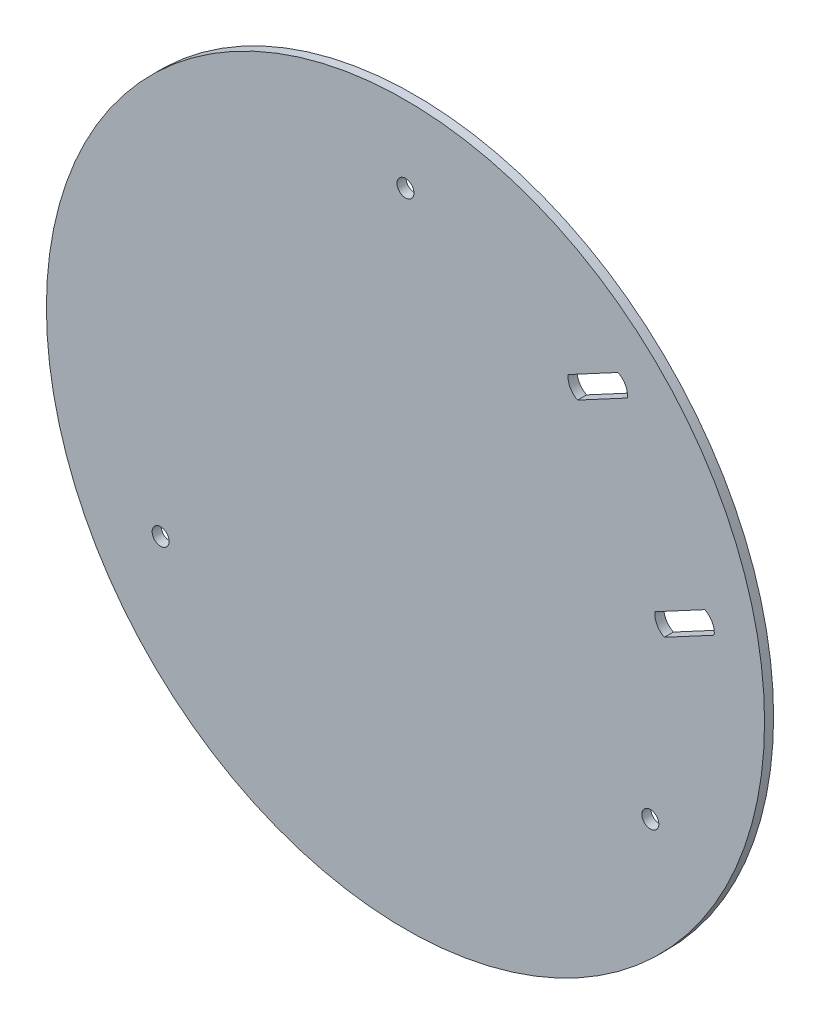
ISO-10303-21;
HEADER;
FILE_DESCRIPTION(('STEP AP214'),'2;1');
FILE_NAME('part.step','',(''),(''),'','','');
FILE_SCHEMA(('AUTOMOTIVE_DESIGN { 1 0 10303 214 1 1 1 1 }'));
ENDSEC;
DATA;
#1=APPLICATION_CONTEXT('core data for automotive mechanical design processes');
#2=APPLICATION_PROTOCOL_DEFINITION('international standard','automotive_design',2000,#1);
#3=PRODUCT_CONTEXT('',#1,'mechanical');
#4=PRODUCT('Part','Part','',(#3));
#5=PRODUCT_RELATED_PRODUCT_CATEGORY('part','',(#4));
#6=PRODUCT_DEFINITION_FORMATION('','',#4);
#7=PRODUCT_DEFINITION_CONTEXT('part definition',#1,'design');
#8=PRODUCT_DEFINITION('design','',#6,#7);
#9=PRODUCT_DEFINITION_SHAPE('','',#8);
#10=(LENGTH_UNIT() NAMED_UNIT(*) SI_UNIT(.MILLI.,.METRE.));
#11=(NAMED_UNIT(*) PLANE_ANGLE_UNIT() SI_UNIT($,.RADIAN.));
#12=(NAMED_UNIT(*) SI_UNIT($,.STERADIAN.) SOLID_ANGLE_UNIT());
#13=UNCERTAINTY_MEASURE_WITH_UNIT(LENGTH_MEASURE(1.E-05),#10,'distance_accuracy_value','');
#14=(GEOMETRIC_REPRESENTATION_CONTEXT(3) GLOBAL_UNCERTAINTY_ASSIGNED_CONTEXT((#13)) GLOBAL_UNIT_ASSIGNED_CONTEXT((#10,
#11,#12)) REPRESENTATION_CONTEXT('',''));
#15=CARTESIAN_POINT('',(0.,0.,0.));
#16=DIRECTION('',(0.,0.,1.));
#17=DIRECTION('',(1.,0.,0.));
#18=AXIS2_PLACEMENT_3D('',#15,#16,#17);
#19=CARTESIAN_POINT('',(0.,0.,1.6));
#20=DIRECTION('',(0.,0.,1.));
#21=DIRECTION('',(1.,0.,0.));
#22=AXIS2_PLACEMENT_3D('',#19,#20,#21);
#23=PLANE('',#22);
#24=CARTESIAN_POINT('',(0.,50.,1.6));
#25=DIRECTION('',(0.,0.,-1.));
#26=DIRECTION('',(-1.,0.,0.));
#27=AXIS2_PLACEMENT_3D('',#24,#25,#26);
#28=CIRCLE('',#27,1.5);
#29=CARTESIAN_POINT('',(-1.5,50.,1.6));
#30=VERTEX_POINT('',#29);
#31=EDGE_CURVE('E167',#30,#30,#28,.T.);
#32=ORIENTED_EDGE('',*,*,#31,.T.);
#33=EDGE_LOOP('',(#32));
#34=FACE_BOUND('',#33,.T.);
#35=CARTESIAN_POINT('',(43.3012701892187,-25.0000000000019,1.6));
#36=DIRECTION('',(0.,0.,-1.));
#37=DIRECTION('',(-1.,0.,0.));
#38=AXIS2_PLACEMENT_3D('',#35,#36,#37);
#39=CIRCLE('',#38,1.50000000000405);
#40=CARTESIAN_POINT('',(41.8012701892147,-25.0000000000019,1.6));
#41=VERTEX_POINT('',#40);
#42=EDGE_CURVE('E176',#41,#41,#39,.T.);
#43=ORIENTED_EDGE('',*,*,#42,.T.);
#44=EDGE_LOOP('',(#43));
#45=FACE_BOUND('',#44,.T.);
#46=CARTESIAN_POINT('',(-43.3012701892251,-24.9999999999982,1.6));
#47=DIRECTION('',(0.,0.,-1.));
#48=DIRECTION('',(-1.,0.,0.));
#49=AXIS2_PLACEMENT_3D('',#46,#47,#48);
#50=CIRCLE('',#49,1.50000000000274);
#51=CARTESIAN_POINT('',(-44.8012701892279,-24.9999999999982,1.6));
#52=VERTEX_POINT('',#51);
#53=EDGE_CURVE('E166',#52,#52,#50,.T.);
#54=ORIENTED_EDGE('',*,*,#53,.T.);
#55=EDGE_LOOP('',(#54));
#56=FACE_BOUND('',#55,.T.);
#57=CARTESIAN_POINT('',(0.,0.,1.6));
#58=DIRECTION('',(0.,0.,1.));
#59=DIRECTION('',(1.,0.,0.));
#60=AXIS2_PLACEMENT_3D('',#57,#58,#59);
#61=CIRCLE('',#60,63.5);
#62=CARTESIAN_POINT('',(63.5,0.,1.6));
#63=VERTEX_POINT('',#62);
#64=EDGE_CURVE('E11',#63,#63,#61,.T.);
#65=ORIENTED_EDGE('',*,*,#64,.T.);
#66=EDGE_LOOP('',(#65));
#67=FACE_BOUND('',#66,.T.);
#68=DIRECTION('',(0.881460712640204,0.472257357880026,0.));
#69=VECTOR('',#68,1.);
#70=CARTESIAN_POINT('',(-8.50063244184047,15.8662928275237,1.6));
#71=LINE('',#70,#69);
#72=CARTESIAN_POINT('',(28.7725515184467,35.8360261627023,1.6));
#73=VERTEX_POINT('',#72);
#74=CARTESIAN_POINT('',(37.5871586448488,40.5585997415026,1.6));
#75=VERTEX_POINT('',#74);
#76=EDGE_CURVE('E152',#73,#75,#71,.T.);
#77=ORIENTED_EDGE('',*,*,#76,.T.);
#78=CARTESIAN_POINT('',(36.2099572395383,37.8354000996822,1.6));
#79=DIRECTION('',(0.,0.,1.));
#80=DIRECTION('',(1.,0.,0.));
#81=AXIS2_PLACEMENT_3D('',#78,#79,#80);
#82=CIRCLE('',#81,3.05163890393342);
#83=CARTESIAN_POINT('',(39.2400593974289,37.4734872472619,1.6));
#84=VERTEX_POINT('',#83);
#85=EDGE_CURVE('E160',#75,#84,#82,.F.);
#86=ORIENTED_EDGE('',*,*,#85,.T.);
#87=DIRECTION('',(0.881460712640204,0.472257357880026,0.));
#88=VECTOR('',#87,1.);
#89=CARTESIAN_POINT('',(-6.84773168926038,12.781180333283,1.6));
#90=LINE('',#89,#88);
#91=CARTESIAN_POINT('',(30.4254522710268,32.7509136684616,1.6));
#92=VERTEX_POINT('',#91);
#93=EDGE_CURVE('E120',#92,#84,#90,.T.);
#94=ORIENTED_EDGE('',*,*,#93,.F.);
#95=CARTESIAN_POINT('',(31.8026536763373,35.474113310282,1.6));
#96=DIRECTION('',(0.,0.,1.));
#97=DIRECTION('',(1.,0.,0.));
#98=AXIS2_PLACEMENT_3D('',#95,#96,#97);
#99=CIRCLE('',#98,3.05163890393342);
#100=EDGE_CURVE('E158',#73,#92,#99,.T.);
#101=ORIENTED_EDGE('',*,*,#100,.F.);
#102=EDGE_LOOP('',(#77,#86,#94,#101));
#103=FACE_BOUND('',#102,.T.);
#104=DIRECTION('',(0.881460712640204,0.472257357880026,0.));
#105=VECTOR('',#104,1.);
#106=CARTESIAN_POINT('',(6.84773168926038,-12.781180333283,1.6));
#107=LINE('',#106,#105);
#108=CARTESIAN_POINT('',(44.1209156495476,7.18855300189569,1.6));
#109=VERTEX_POINT('',#108);
#110=CARTESIAN_POINT('',(52.9355227759496,11.911126580696,1.6));
#111=VERTEX_POINT('',#110);
#112=EDGE_CURVE('E156',#109,#111,#107,.T.);
#113=ORIENTED_EDGE('',*,*,#112,.T.);
#114=CARTESIAN_POINT('',(51.5583213706392,9.18792693887552,1.6));
#115=DIRECTION('',(0.,0.,1.));
#116=DIRECTION('',(1.,0.,0.));
#117=AXIS2_PLACEMENT_3D('',#114,#115,#116);
#118=CIRCLE('',#117,3.05163890393343);
#119=CARTESIAN_POINT('',(54.5884235285297,8.82601408645523,1.6));
#120=VERTEX_POINT('',#119);
#121=EDGE_CURVE('E119',#111,#120,#118,.F.);
#122=ORIENTED_EDGE('',*,*,#121,.T.);
#123=DIRECTION('',(0.881460712640204,0.472257357880027,0.));
#124=VECTOR('',#123,1.);
#125=CARTESIAN_POINT('',(8.50063244184048,-15.8662928275237,1.6));
#126=LINE('',#125,#124);
#127=CARTESIAN_POINT('',(45.7738164021277,4.10344050765497,1.6));
#128=VERTEX_POINT('',#127);
#129=EDGE_CURVE('E154',#128,#120,#126,.T.);
#130=ORIENTED_EDGE('',*,*,#129,.F.);
#131=CARTESIAN_POINT('',(47.1510178074381,6.82664014947539,1.6));
#132=DIRECTION('',(0.,0.,1.));
#133=DIRECTION('',(1.,0.,0.));
#134=AXIS2_PLACEMENT_3D('',#131,#132,#133);
#135=CIRCLE('',#134,3.05163890393343);
#136=EDGE_CURVE('E163',#109,#128,#135,.T.);
#137=ORIENTED_EDGE('',*,*,#136,.F.);
#138=EDGE_LOOP('',(#113,#122,#130,#137));
#139=FACE_BOUND('',#138,.T.);
#140=ADVANCED_FACE('F34',(#34,#45,#56,#67,#103,#139),#23,.T.);
#141=CARTESIAN_POINT('',(0.,0.,0.));
#142=DIRECTION('',(0.,0.,1.));
#143=DIRECTION('',(1.,0.,0.));
#144=AXIS2_PLACEMENT_3D('',#141,#142,#143);
#145=PLANE('',#144);
#146=CARTESIAN_POINT('',(0.,50.,0.));
#147=DIRECTION('',(0.,0.,-1.));
#148=DIRECTION('',(-1.,0.,0.));
#149=AXIS2_PLACEMENT_3D('',#146,#147,#148);
#150=CIRCLE('',#149,1.5);
#151=CARTESIAN_POINT('',(-1.5,50.,0.));
#152=VERTEX_POINT('',#151);
#153=EDGE_CURVE('E170',#152,#152,#150,.T.);
#154=ORIENTED_EDGE('',*,*,#153,.F.);
#155=EDGE_LOOP('',(#154));
#156=FACE_BOUND('',#155,.T.);
#157=CARTESIAN_POINT('',(43.3012701892187,-25.0000000000019,0.));
#158=DIRECTION('',(0.,0.,-1.));
#159=DIRECTION('',(-1.,0.,0.));
#160=AXIS2_PLACEMENT_3D('',#157,#158,#159);
#161=CIRCLE('',#160,1.50000000000405);
#162=CARTESIAN_POINT('',(41.8012701892147,-25.0000000000019,0.));
#163=VERTEX_POINT('',#162);
#164=EDGE_CURVE('E173',#163,#163,#161,.T.);
#165=ORIENTED_EDGE('',*,*,#164,.F.);
#166=EDGE_LOOP('',(#165));
#167=FACE_BOUND('',#166,.T.);
#168=CARTESIAN_POINT('',(-43.3012701892251,-24.9999999999982,0.));
#169=DIRECTION('',(0.,0.,-1.));
#170=DIRECTION('',(-1.,0.,0.));
#171=AXIS2_PLACEMENT_3D('',#168,#169,#170);
#172=CIRCLE('',#171,1.50000000000274);
#173=CARTESIAN_POINT('',(-44.8012701892279,-24.9999999999982,0.));
#174=VERTEX_POINT('',#173);
#175=EDGE_CURVE('E179',#174,#174,#172,.T.);
#176=ORIENTED_EDGE('',*,*,#175,.F.);
#177=EDGE_LOOP('',(#176));
#178=FACE_BOUND('',#177,.T.);
#179=CARTESIAN_POINT('',(0.,0.,0.));
#180=DIRECTION('',(0.,0.,1.));
#181=DIRECTION('',(1.,0.,0.));
#182=AXIS2_PLACEMENT_3D('',#179,#180,#181);
#183=CIRCLE('',#182,63.5);
#184=CARTESIAN_POINT('',(63.5,0.,0.));
#185=VERTEX_POINT('',#184);
#186=EDGE_CURVE('E38',#185,#185,#183,.T.);
#187=ORIENTED_EDGE('',*,*,#186,.F.);
#188=EDGE_LOOP('',(#187));
#189=FACE_BOUND('',#188,.T.);
#190=CARTESIAN_POINT('',(36.2099572395383,37.8354000996822,0.));
#191=DIRECTION('',(0.,0.,1.));
#192=DIRECTION('',(1.,0.,0.));
#193=AXIS2_PLACEMENT_3D('',#190,#191,#192);
#194=CIRCLE('',#193,3.05163890393342);
#195=CARTESIAN_POINT('',(39.2400593974289,37.4734872472619,0.));
#196=VERTEX_POINT('',#195);
#197=CARTESIAN_POINT('',(37.5871586448488,40.5585997415026,0.));
#198=VERTEX_POINT('',#197);
#199=EDGE_CURVE('E123',#196,#198,#194,.T.);
#200=ORIENTED_EDGE('',*,*,#199,.T.);
#201=DIRECTION('',(-0.881460712640204,-0.472257357880026,0.));
#202=VECTOR('',#201,1.);
#203=CARTESIAN_POINT('',(37.5871586448488,40.5585997415026,0.));
#204=LINE('',#203,#202);
#205=CARTESIAN_POINT('',(28.7725515184467,35.8360261627023,0.));
#206=VERTEX_POINT('',#205);
#207=EDGE_CURVE('E125',#198,#206,#204,.T.);
#208=ORIENTED_EDGE('',*,*,#207,.T.);
#209=CARTESIAN_POINT('',(31.8026536763373,35.474113310282,0.));
#210=DIRECTION('',(0.,0.,-1.));
#211=DIRECTION('',(-1.,0.,0.));
#212=AXIS2_PLACEMENT_3D('',#209,#210,#211);
#213=CIRCLE('',#212,3.05163890393342);
#214=CARTESIAN_POINT('',(30.4254522710268,32.7509136684616,0.));
#215=VERTEX_POINT('',#214);
#216=EDGE_CURVE('E146',#215,#206,#213,.T.);
#217=ORIENTED_EDGE('',*,*,#216,.F.);
#218=DIRECTION('',(-0.881460712640204,-0.472257357880026,0.));
#219=VECTOR('',#218,1.);
#220=CARTESIAN_POINT('',(39.2400593974289,37.4734872472619,0.));
#221=LINE('',#220,#219);
#222=EDGE_CURVE('E57',#196,#215,#221,.T.);
#223=ORIENTED_EDGE('',*,*,#222,.F.);
#224=EDGE_LOOP('',(#200,#208,#217,#223));
#225=FACE_BOUND('',#224,.T.);
#226=CARTESIAN_POINT('',(51.5583213706392,9.18792693887552,0.));
#227=DIRECTION('',(0.,0.,1.));
#228=DIRECTION('',(1.,0.,0.));
#229=AXIS2_PLACEMENT_3D('',#226,#227,#228);
#230=CIRCLE('',#229,3.05163890393343);
#231=CARTESIAN_POINT('',(54.5884235285297,8.82601408645523,0.));
#232=VERTEX_POINT('',#231);
#233=CARTESIAN_POINT('',(52.9355227759496,11.911126580696,0.));
#234=VERTEX_POINT('',#233);
#235=EDGE_CURVE('E111',#232,#234,#230,.T.);
#236=ORIENTED_EDGE('',*,*,#235,.T.);
#237=DIRECTION('',(-0.881460712640204,-0.472257357880026,0.));
#238=VECTOR('',#237,1.);
#239=CARTESIAN_POINT('',(52.9355227759496,11.911126580696,0.));
#240=LINE('',#239,#238);
#241=CARTESIAN_POINT('',(44.1209156495476,7.18855300189569,0.));
#242=VERTEX_POINT('',#241);
#243=EDGE_CURVE('E103',#234,#242,#240,.T.);
#244=ORIENTED_EDGE('',*,*,#243,.T.);
#245=CARTESIAN_POINT('',(47.1510178074381,6.82664014947539,0.));
#246=DIRECTION('',(0.,0.,-1.));
#247=DIRECTION('',(-1.,0.,0.));
#248=AXIS2_PLACEMENT_3D('',#245,#246,#247);
#249=CIRCLE('',#248,3.05163890393343);
#250=CARTESIAN_POINT('',(45.7738164021277,4.10344050765497,0.));
#251=VERTEX_POINT('',#250);
#252=EDGE_CURVE('E110',#251,#242,#249,.T.);
#253=ORIENTED_EDGE('',*,*,#252,.F.);
#254=DIRECTION('',(-0.881460712640204,-0.472257357880027,0.));
#255=VECTOR('',#254,1.);
#256=CARTESIAN_POINT('',(54.5884235285297,8.82601408645523,0.));
#257=LINE('',#256,#255);
#258=EDGE_CURVE('E49',#232,#251,#257,.T.);
#259=ORIENTED_EDGE('',*,*,#258,.F.);
#260=EDGE_LOOP('',(#236,#244,#253,#259));
#261=FACE_BOUND('',#260,.T.);
#262=ADVANCED_FACE('F122',(#156,#167,#178,#189,#225,#261),#145,.F.);
#263=CARTESIAN_POINT('',(0.,0.,1.6));
#264=DIRECTION('',(0.,0.,-1.));
#265=DIRECTION('',(-1.,0.,0.));
#266=AXIS2_PLACEMENT_3D('',#263,#264,#265);
#267=CYLINDRICAL_SURFACE('',#266,63.5);
#268=ORIENTED_EDGE('',*,*,#64,.F.);
#269=EDGE_LOOP('',(#268));
#270=FACE_BOUND('',#269,.T.);
#271=ORIENTED_EDGE('',*,*,#186,.T.);
#272=EDGE_LOOP('',(#271));
#273=FACE_BOUND('',#272,.T.);
#274=ADVANCED_FACE('F36',(#270,#273),#267,.T.);
#275=CARTESIAN_POINT('',(-43.3012701892251,-24.9999999999982,1.6));
#276=DIRECTION('',(0.,0.,-1.));
#277=DIRECTION('',(-1.,0.,0.));
#278=AXIS2_PLACEMENT_3D('',#275,#276,#277);
#279=CYLINDRICAL_SURFACE('',#278,1.50000000000274);
#280=ORIENTED_EDGE('',*,*,#53,.F.);
#281=EDGE_LOOP('',(#280));
#282=FACE_BOUND('',#281,.T.);
#283=ORIENTED_EDGE('',*,*,#175,.T.);
#284=EDGE_LOOP('',(#283));
#285=FACE_BOUND('',#284,.T.);
#286=ADVANCED_FACE('F187',(#282,#285),#279,.F.);
#287=CARTESIAN_POINT('',(43.3012701892187,-25.0000000000019,1.6));
#288=DIRECTION('',(0.,0.,-1.));
#289=DIRECTION('',(-1.,0.,0.));
#290=AXIS2_PLACEMENT_3D('',#287,#288,#289);
#291=CYLINDRICAL_SURFACE('',#290,1.50000000000405);
#292=ORIENTED_EDGE('',*,*,#42,.F.);
#293=EDGE_LOOP('',(#292));
#294=FACE_BOUND('',#293,.T.);
#295=ORIENTED_EDGE('',*,*,#164,.T.);
#296=EDGE_LOOP('',(#295));
#297=FACE_BOUND('',#296,.T.);
#298=ADVANCED_FACE('F190',(#294,#297),#291,.F.);
#299=CARTESIAN_POINT('',(0.,50.,1.6));
#300=DIRECTION('',(0.,0.,-1.));
#301=DIRECTION('',(-1.,0.,0.));
#302=AXIS2_PLACEMENT_3D('',#299,#300,#301);
#303=CYLINDRICAL_SURFACE('',#302,1.5);
#304=ORIENTED_EDGE('',*,*,#31,.F.);
#305=EDGE_LOOP('',(#304));
#306=FACE_BOUND('',#305,.T.);
#307=ORIENTED_EDGE('',*,*,#153,.T.);
#308=EDGE_LOOP('',(#307));
#309=FACE_BOUND('',#308,.T.);
#310=ADVANCED_FACE('F237',(#306,#309),#303,.F.);
#311=CARTESIAN_POINT('',(37.5871586448488,40.5585997415026,10.));
#312=DIRECTION('',(0.472257357880026,-0.881460712640204,0.));
#313=DIRECTION('',(0.881460712640204,0.472257357880026,0.));
#314=AXIS2_PLACEMENT_3D('',#311,#312,#313);
#315=PLANE('',#314);
#316=DIRECTION('',(0.,0.,-1.));
#317=VECTOR('',#316,1.);
#318=CARTESIAN_POINT('',(28.7725515184467,35.8360261627023,10.));
#319=LINE('',#318,#317);
#320=EDGE_CURVE('E138',#73,#206,#319,.T.);
#321=ORIENTED_EDGE('',*,*,#320,.T.);
#322=ORIENTED_EDGE('',*,*,#207,.F.);
#323=DIRECTION('',(0.,0.,-1.));
#324=VECTOR('',#323,1.);
#325=CARTESIAN_POINT('',(37.5871586448488,40.5585997415026,10.));
#326=LINE('',#325,#324);
#327=EDGE_CURVE('E135',#75,#198,#326,.T.);
#328=ORIENTED_EDGE('',*,*,#327,.F.);
#329=ORIENTED_EDGE('',*,*,#76,.F.);
#330=EDGE_LOOP('',(#321,#322,#328,#329));
#331=FACE_BOUND('',#330,.T.);
#332=ADVANCED_FACE('F212',(#331),#315,.T.);
#333=CARTESIAN_POINT('',(39.2400593974289,37.4734872472619,10.));
#334=DIRECTION('',(0.472257357880026,-0.881460712640204,0.));
#335=DIRECTION('',(0.881460712640204,0.472257357880026,0.));
#336=AXIS2_PLACEMENT_3D('',#333,#334,#335);
#337=PLANE('',#336);
#338=ORIENTED_EDGE('',*,*,#93,.T.);
#339=DIRECTION('',(0.,0.,-1.));
#340=VECTOR('',#339,1.);
#341=CARTESIAN_POINT('',(39.2400593974289,37.4734872472619,10.));
#342=LINE('',#341,#340);
#343=EDGE_CURVE('E142',#84,#196,#342,.T.);
#344=ORIENTED_EDGE('',*,*,#343,.T.);
#345=ORIENTED_EDGE('',*,*,#222,.T.);
#346=DIRECTION('',(0.,0.,-1.));
#347=VECTOR('',#346,1.);
#348=CARTESIAN_POINT('',(30.4254522710268,32.7509136684616,10.));
#349=LINE('',#348,#347);
#350=EDGE_CURVE('E140',#92,#215,#349,.T.);
#351=ORIENTED_EDGE('',*,*,#350,.F.);
#352=EDGE_LOOP('',(#338,#344,#345,#351));
#353=FACE_BOUND('',#352,.T.);
#354=ADVANCED_FACE('F205',(#353),#337,.F.);
#355=CARTESIAN_POINT('',(36.2099572395383,37.8354000996822,10.));
#356=DIRECTION('',(0.,0.,-1.));
#357=DIRECTION('',(-1.,0.,0.));
#358=AXIS2_PLACEMENT_3D('',#355,#356,#357);
#359=CYLINDRICAL_SURFACE('',#358,3.05163890393342);
#360=ORIENTED_EDGE('',*,*,#327,.T.);
#361=ORIENTED_EDGE('',*,*,#199,.F.);
#362=ORIENTED_EDGE('',*,*,#343,.F.);
#363=ORIENTED_EDGE('',*,*,#85,.F.);
#364=EDGE_LOOP('',(#360,#361,#362,#363));
#365=FACE_BOUND('',#364,.T.);
#366=ADVANCED_FACE('F201',(#365),#359,.F.);
#367=CARTESIAN_POINT('',(31.8026536763373,35.474113310282,10.));
#368=DIRECTION('',(0.,0.,-1.));
#369=DIRECTION('',(-1.,0.,0.));
#370=AXIS2_PLACEMENT_3D('',#367,#368,#369);
#371=CYLINDRICAL_SURFACE('',#370,3.05163890393342);
#372=ORIENTED_EDGE('',*,*,#100,.T.);
#373=ORIENTED_EDGE('',*,*,#350,.T.);
#374=ORIENTED_EDGE('',*,*,#216,.T.);
#375=ORIENTED_EDGE('',*,*,#320,.F.);
#376=EDGE_LOOP('',(#372,#373,#374,#375));
#377=FACE_BOUND('',#376,.T.);
#378=ADVANCED_FACE('F215',(#377),#371,.F.);
#379=CARTESIAN_POINT('',(52.9355227759496,11.911126580696,10.));
#380=DIRECTION('',(0.472257357880026,-0.881460712640204,0.));
#381=DIRECTION('',(0.881460712640204,0.472257357880026,0.));
#382=AXIS2_PLACEMENT_3D('',#379,#380,#381);
#383=PLANE('',#382);
#384=DIRECTION('',(0.,0.,-1.));
#385=VECTOR('',#384,1.);
#386=CARTESIAN_POINT('',(44.1209156495476,7.18855300189569,10.));
#387=LINE('',#386,#385);
#388=EDGE_CURVE('E108',#109,#242,#387,.T.);
#389=ORIENTED_EDGE('',*,*,#388,.T.);
#390=ORIENTED_EDGE('',*,*,#243,.F.);
#391=DIRECTION('',(0.,0.,-1.));
#392=VECTOR('',#391,1.);
#393=CARTESIAN_POINT('',(52.9355227759496,11.911126580696,10.));
#394=LINE('',#393,#392);
#395=EDGE_CURVE('E106',#111,#234,#394,.T.);
#396=ORIENTED_EDGE('',*,*,#395,.F.);
#397=ORIENTED_EDGE('',*,*,#112,.F.);
#398=EDGE_LOOP('',(#389,#390,#396,#397));
#399=FACE_BOUND('',#398,.T.);
#400=ADVANCED_FACE('F105',(#399),#383,.T.);
#401=CARTESIAN_POINT('',(54.5884235285297,8.82601408645523,10.));
#402=DIRECTION('',(0.472257357880027,-0.881460712640204,0.));
#403=DIRECTION('',(0.881460712640204,0.472257357880027,0.));
#404=AXIS2_PLACEMENT_3D('',#401,#402,#403);
#405=PLANE('',#404);
#406=ORIENTED_EDGE('',*,*,#129,.T.);
#407=DIRECTION('',(0.,0.,-1.));
#408=VECTOR('',#407,1.);
#409=CARTESIAN_POINT('',(54.5884235285297,8.82601408645523,10.));
#410=LINE('',#409,#408);
#411=EDGE_CURVE('E130',#120,#232,#410,.T.);
#412=ORIENTED_EDGE('',*,*,#411,.T.);
#413=ORIENTED_EDGE('',*,*,#258,.T.);
#414=DIRECTION('',(0.,0.,-1.));
#415=VECTOR('',#414,1.);
#416=CARTESIAN_POINT('',(45.7738164021277,4.10344050765497,10.));
#417=LINE('',#416,#415);
#418=EDGE_CURVE('E132',#128,#251,#417,.T.);
#419=ORIENTED_EDGE('',*,*,#418,.F.);
#420=EDGE_LOOP('',(#406,#412,#413,#419));
#421=FACE_BOUND('',#420,.T.);
#422=ADVANCED_FACE('F222',(#421),#405,.F.);
#423=CARTESIAN_POINT('',(51.5583213706392,9.18792693887552,10.));
#424=DIRECTION('',(0.,0.,-1.));
#425=DIRECTION('',(-1.,0.,0.));
#426=AXIS2_PLACEMENT_3D('',#423,#424,#425);
#427=CYLINDRICAL_SURFACE('',#426,3.05163890393343);
#428=ORIENTED_EDGE('',*,*,#395,.T.);
#429=ORIENTED_EDGE('',*,*,#235,.F.);
#430=ORIENTED_EDGE('',*,*,#411,.F.);
#431=ORIENTED_EDGE('',*,*,#121,.F.);
#432=EDGE_LOOP('',(#428,#429,#430,#431));
#433=FACE_BOUND('',#432,.T.);
#434=ADVANCED_FACE('F115',(#433),#427,.F.);
#435=CARTESIAN_POINT('',(47.1510178074381,6.82664014947539,10.));
#436=DIRECTION('',(0.,0.,-1.));
#437=DIRECTION('',(-1.,0.,0.));
#438=AXIS2_PLACEMENT_3D('',#435,#436,#437);
#439=CYLINDRICAL_SURFACE('',#438,3.05163890393343);
#440=ORIENTED_EDGE('',*,*,#136,.T.);
#441=ORIENTED_EDGE('',*,*,#418,.T.);
#442=ORIENTED_EDGE('',*,*,#252,.T.);
#443=ORIENTED_EDGE('',*,*,#388,.F.);
#444=EDGE_LOOP('',(#440,#441,#442,#443));
#445=FACE_BOUND('',#444,.T.);
#446=ADVANCED_FACE('F249',(#445),#439,.F.);
#447=CLOSED_SHELL('',(#140,#262,#274,#286,#298,#310,#332,#354,#366,#378,#400,#422,#434,#446));
#448=MANIFOLD_SOLID_BREP('B2',#447);
#449=ADVANCED_BREP_SHAPE_REPRESENTATION('',(#18,#448),#14);
#450=SHAPE_DEFINITION_REPRESENTATION(#9,#449);
ENDSEC;
END-ISO-10303-21;
